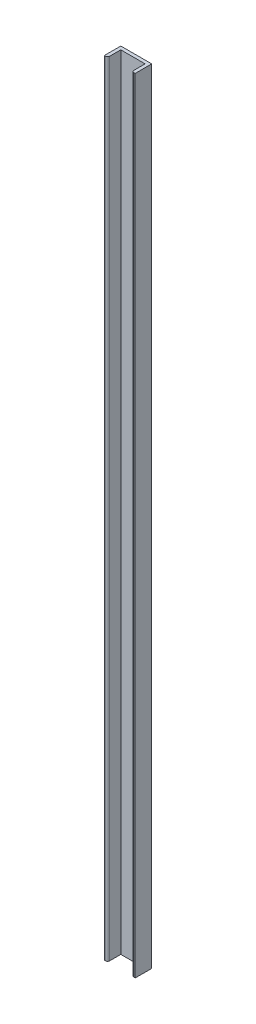
ISO-10303-21;
HEADER;
FILE_DESCRIPTION(('STEP AP214'),'2;1');
FILE_NAME('part.step','',(''),(''),'','','');
FILE_SCHEMA(('AUTOMOTIVE_DESIGN { 1 0 10303 214 1 1 1 1 }'));
ENDSEC;
DATA;
#1=APPLICATION_CONTEXT('core data for automotive mechanical design processes');
#2=APPLICATION_PROTOCOL_DEFINITION('international standard','automotive_design',2000,#1);
#3=PRODUCT_CONTEXT('',#1,'mechanical');
#4=PRODUCT('Part','Part','',(#3));
#5=PRODUCT_RELATED_PRODUCT_CATEGORY('part','',(#4));
#6=PRODUCT_DEFINITION_FORMATION('','',#4);
#7=PRODUCT_DEFINITION_CONTEXT('part definition',#1,'design');
#8=PRODUCT_DEFINITION('design','',#6,#7);
#9=PRODUCT_DEFINITION_SHAPE('','',#8);
#10=(LENGTH_UNIT() NAMED_UNIT(*) SI_UNIT(.MILLI.,.METRE.));
#11=(NAMED_UNIT(*) PLANE_ANGLE_UNIT() SI_UNIT($,.RADIAN.));
#12=(NAMED_UNIT(*) SI_UNIT($,.STERADIAN.) SOLID_ANGLE_UNIT());
#13=UNCERTAINTY_MEASURE_WITH_UNIT(LENGTH_MEASURE(1.E-05),#10,'distance_accuracy_value','');
#14=(GEOMETRIC_REPRESENTATION_CONTEXT(3) GLOBAL_UNCERTAINTY_ASSIGNED_CONTEXT((#13)) GLOBAL_UNIT_ASSIGNED_CONTEXT((#10,
#11,#12)) REPRESENTATION_CONTEXT('',''));
#15=CARTESIAN_POINT('',(0.,0.,0.));
#16=DIRECTION('',(0.,0.,1.));
#17=DIRECTION('',(1.,0.,0.));
#18=AXIS2_PLACEMENT_3D('',#15,#16,#17);
#19=CARTESIAN_POINT('',(-37.5,1900.,40.));
#20=DIRECTION('',(1.,0.,0.));
#21=DIRECTION('',(0.,0.,-1.));
#22=AXIS2_PLACEMENT_3D('',#19,#20,#21);
#23=PLANE('',#22);
#24=DIRECTION('',(0.,0.,1.));
#25=VECTOR('',#24,1.);
#26=CARTESIAN_POINT('',(-37.5,0.,40.));
#27=LINE('',#26,#25);
#28=CARTESIAN_POINT('',(-37.5,0.,0.));
#29=VERTEX_POINT('',#28);
#30=CARTESIAN_POINT('',(-37.5,0.,40.));
#31=VERTEX_POINT('',#30);
#32=EDGE_CURVE('E182',#29,#31,#27,.T.);
#33=ORIENTED_EDGE('',*,*,#32,.T.);
#34=DIRECTION('',(0.,-1.,0.));
#35=VECTOR('',#34,1.);
#36=CARTESIAN_POINT('',(-37.5,1900.,40.));
#37=LINE('',#36,#35);
#38=CARTESIAN_POINT('',(-37.5,1900.,40.));
#39=VERTEX_POINT('',#38);
#40=EDGE_CURVE('E13',#39,#31,#37,.T.);
#41=ORIENTED_EDGE('',*,*,#40,.F.);
#42=DIRECTION('',(0.,0.,1.));
#43=VECTOR('',#42,1.);
#44=CARTESIAN_POINT('',(-37.5,1900.,40.));
#45=LINE('',#44,#43);
#46=CARTESIAN_POINT('',(-37.5,1900.,0.));
#47=VERTEX_POINT('',#46);
#48=EDGE_CURVE('E200',#47,#39,#45,.T.);
#49=ORIENTED_EDGE('',*,*,#48,.F.);
#50=DIRECTION('',(0.,-1.,0.));
#51=VECTOR('',#50,1.);
#52=CARTESIAN_POINT('',(-37.5,1900.,0.));
#53=LINE('',#52,#51);
#54=EDGE_CURVE('E178',#47,#29,#53,.T.);
#55=ORIENTED_EDGE('',*,*,#54,.T.);
#56=EDGE_LOOP('',(#33,#41,#49,#55));
#57=FACE_BOUND('',#56,.T.);
#58=ADVANCED_FACE('F74',(#57),#23,.F.);
#59=CARTESIAN_POINT('',(-34.5,1900.,40.));
#60=DIRECTION('',(0.,0.,-1.));
#61=DIRECTION('',(-1.,0.,0.));
#62=AXIS2_PLACEMENT_3D('',#59,#60,#61);
#63=PLANE('',#62);
#64=DIRECTION('',(1.,0.,0.));
#65=VECTOR('',#64,1.);
#66=CARTESIAN_POINT('',(-34.5,0.,40.));
#67=LINE('',#66,#65);
#68=CARTESIAN_POINT('',(-34.5,0.,40.));
#69=VERTEX_POINT('',#68);
#70=EDGE_CURVE('E185',#31,#69,#67,.T.);
#71=ORIENTED_EDGE('',*,*,#70,.T.);
#72=DIRECTION('',(0.,-1.,0.));
#73=VECTOR('',#72,1.);
#74=CARTESIAN_POINT('',(-34.5,1900.,40.));
#75=LINE('',#74,#73);
#76=CARTESIAN_POINT('',(-34.5,1900.,40.));
#77=VERTEX_POINT('',#76);
#78=EDGE_CURVE('E82',#77,#69,#75,.T.);
#79=ORIENTED_EDGE('',*,*,#78,.F.);
#80=DIRECTION('',(1.,0.,0.));
#81=VECTOR('',#80,1.);
#82=CARTESIAN_POINT('',(-34.5,1900.,40.));
#83=LINE('',#82,#81);
#84=EDGE_CURVE('E139',#39,#77,#83,.T.);
#85=ORIENTED_EDGE('',*,*,#84,.F.);
#86=ORIENTED_EDGE('',*,*,#40,.T.);
#87=EDGE_LOOP('',(#71,#79,#85,#86));
#88=FACE_BOUND('',#87,.T.);
#89=ADVANCED_FACE('F249',(#88),#63,.F.);
#90=CARTESIAN_POINT('',(-34.5,1900.,35.));
#91=DIRECTION('',(0.,-1.,0.));
#92=DIRECTION('',(0.,0.,-1.));
#93=AXIS2_PLACEMENT_3D('',#90,#91,#92);
#94=CYLINDRICAL_SURFACE('',#93,5.);
#95=CARTESIAN_POINT('',(-34.5,0.,35.));
#96=DIRECTION('',(0.,1.,0.));
#97=DIRECTION('',(0.,0.,-1.));
#98=AXIS2_PLACEMENT_3D('',#95,#96,#97);
#99=CIRCLE('',#98,5.);
#100=CARTESIAN_POINT('',(-29.5,0.,35.));
#101=VERTEX_POINT('',#100);
#102=EDGE_CURVE('E187',#69,#101,#99,.T.);
#103=ORIENTED_EDGE('',*,*,#102,.T.);
#104=DIRECTION('',(0.,-1.,0.));
#105=VECTOR('',#104,1.);
#106=CARTESIAN_POINT('',(-29.5,1900.,35.));
#107=LINE('',#106,#105);
#108=CARTESIAN_POINT('',(-29.5,1900.,35.));
#109=VERTEX_POINT('',#108);
#110=EDGE_CURVE('E213',#109,#101,#107,.T.);
#111=ORIENTED_EDGE('',*,*,#110,.F.);
#112=CARTESIAN_POINT('',(-34.5,1900.,35.));
#113=DIRECTION('',(0.,1.,0.));
#114=DIRECTION('',(0.,0.,-1.));
#115=AXIS2_PLACEMENT_3D('',#112,#113,#114);
#116=CIRCLE('',#115,5.);
#117=EDGE_CURVE('E221',#77,#109,#116,.T.);
#118=ORIENTED_EDGE('',*,*,#117,.F.);
#119=ORIENTED_EDGE('',*,*,#78,.T.);
#120=EDGE_LOOP('',(#103,#111,#118,#119));
#121=FACE_BOUND('',#120,.T.);
#122=ADVANCED_FACE('F219',(#121),#94,.T.);
#123=CARTESIAN_POINT('',(-29.5,1900.,8.00000000000001));
#124=DIRECTION('',(-1.,0.,0.));
#125=DIRECTION('',(0.,0.,1.));
#126=AXIS2_PLACEMENT_3D('',#123,#124,#125);
#127=PLANE('',#126);
#128=DIRECTION('',(0.,0.,-1.));
#129=VECTOR('',#128,1.);
#130=CARTESIAN_POINT('',(-29.5,0.,8.00000000000001));
#131=LINE('',#130,#129);
#132=CARTESIAN_POINT('',(-29.5,0.,8.00000000000001));
#133=VERTEX_POINT('',#132);
#134=EDGE_CURVE('E189',#101,#133,#131,.T.);
#135=ORIENTED_EDGE('',*,*,#134,.T.);
#136=DIRECTION('',(0.,-1.,0.));
#137=VECTOR('',#136,1.);
#138=CARTESIAN_POINT('',(-29.5,1900.,8.00000000000001));
#139=LINE('',#138,#137);
#140=CARTESIAN_POINT('',(-29.5,1900.,8.00000000000001));
#141=VERTEX_POINT('',#140);
#142=EDGE_CURVE('E210',#141,#133,#139,.T.);
#143=ORIENTED_EDGE('',*,*,#142,.F.);
#144=DIRECTION('',(0.,0.,-1.));
#145=VECTOR('',#144,1.);
#146=CARTESIAN_POINT('',(-29.5,1900.,8.00000000000001));
#147=LINE('',#146,#145);
#148=EDGE_CURVE('E239',#109,#141,#147,.T.);
#149=ORIENTED_EDGE('',*,*,#148,.F.);
#150=ORIENTED_EDGE('',*,*,#110,.T.);
#151=EDGE_LOOP('',(#135,#143,#149,#150));
#152=FACE_BOUND('',#151,.T.);
#153=ADVANCED_FACE('F230',(#152),#127,.F.);
#154=CARTESIAN_POINT('',(29.5,1900.,8.));
#155=DIRECTION('',(0.,0.,-1.));
#156=DIRECTION('',(-1.,0.,0.));
#157=AXIS2_PLACEMENT_3D('',#154,#155,#156);
#158=PLANE('',#157);
#159=DIRECTION('',(1.,0.,0.));
#160=VECTOR('',#159,1.);
#161=CARTESIAN_POINT('',(29.5,0.,8.));
#162=LINE('',#161,#160);
#163=CARTESIAN_POINT('',(29.5,0.,8.));
#164=VERTEX_POINT('',#163);
#165=EDGE_CURVE('E191',#133,#164,#162,.T.);
#166=ORIENTED_EDGE('',*,*,#165,.T.);
#167=DIRECTION('',(0.,-1.,0.));
#168=VECTOR('',#167,1.);
#169=CARTESIAN_POINT('',(29.5,1900.,8.));
#170=LINE('',#169,#168);
#171=CARTESIAN_POINT('',(29.5,1900.,8.));
#172=VERTEX_POINT('',#171);
#173=EDGE_CURVE('E207',#172,#164,#170,.T.);
#174=ORIENTED_EDGE('',*,*,#173,.F.);
#175=DIRECTION('',(1.,0.,0.));
#176=VECTOR('',#175,1.);
#177=CARTESIAN_POINT('',(29.5,1900.,8.));
#178=LINE('',#177,#176);
#179=EDGE_CURVE('E236',#141,#172,#178,.T.);
#180=ORIENTED_EDGE('',*,*,#179,.F.);
#181=ORIENTED_EDGE('',*,*,#142,.T.);
#182=EDGE_LOOP('',(#166,#174,#180,#181));
#183=FACE_BOUND('',#182,.T.);
#184=ADVANCED_FACE('F234',(#183),#158,.F.);
#185=CARTESIAN_POINT('',(29.5,1900.,35.));
#186=DIRECTION('',(1.,0.,0.));
#187=DIRECTION('',(0.,0.,-1.));
#188=AXIS2_PLACEMENT_3D('',#185,#186,#187);
#189=PLANE('',#188);
#190=DIRECTION('',(0.,0.,1.));
#191=VECTOR('',#190,1.);
#192=CARTESIAN_POINT('',(29.5,0.,35.));
#193=LINE('',#192,#191);
#194=CARTESIAN_POINT('',(29.5,0.,35.));
#195=VERTEX_POINT('',#194);
#196=EDGE_CURVE('E193',#164,#195,#193,.T.);
#197=ORIENTED_EDGE('',*,*,#196,.T.);
#198=DIRECTION('',(0.,-1.,0.));
#199=VECTOR('',#198,1.);
#200=CARTESIAN_POINT('',(29.5,1900.,35.));
#201=LINE('',#200,#199);
#202=CARTESIAN_POINT('',(29.5,1900.,35.));
#203=VERTEX_POINT('',#202);
#204=EDGE_CURVE('E204',#203,#195,#201,.T.);
#205=ORIENTED_EDGE('',*,*,#204,.F.);
#206=DIRECTION('',(0.,0.,1.));
#207=VECTOR('',#206,1.);
#208=CARTESIAN_POINT('',(29.5,1900.,35.));
#209=LINE('',#208,#207);
#210=EDGE_CURVE('E238',#172,#203,#209,.T.);
#211=ORIENTED_EDGE('',*,*,#210,.F.);
#212=ORIENTED_EDGE('',*,*,#173,.T.);
#213=EDGE_LOOP('',(#197,#205,#211,#212));
#214=FACE_BOUND('',#213,.T.);
#215=ADVANCED_FACE('F261',(#214),#189,.F.);
#216=CARTESIAN_POINT('',(34.5,1900.,35.));
#217=DIRECTION('',(0.,-1.,0.));
#218=DIRECTION('',(0.,0.,-1.));
#219=AXIS2_PLACEMENT_3D('',#216,#217,#218);
#220=CYLINDRICAL_SURFACE('',#219,5.);
#221=CARTESIAN_POINT('',(34.5,0.,35.));
#222=DIRECTION('',(0.,1.,0.));
#223=DIRECTION('',(0.,0.,-1.));
#224=AXIS2_PLACEMENT_3D('',#221,#222,#223);
#225=CIRCLE('',#224,5.);
#226=CARTESIAN_POINT('',(34.5,0.,40.));
#227=VERTEX_POINT('',#226);
#228=EDGE_CURVE('E195',#195,#227,#225,.T.);
#229=ORIENTED_EDGE('',*,*,#228,.T.);
#230=DIRECTION('',(0.,-1.,0.));
#231=VECTOR('',#230,1.);
#232=CARTESIAN_POINT('',(34.5,1900.,40.));
#233=LINE('',#232,#231);
#234=CARTESIAN_POINT('',(34.5,1900.,40.));
#235=VERTEX_POINT('',#234);
#236=EDGE_CURVE('E173',#235,#227,#233,.T.);
#237=ORIENTED_EDGE('',*,*,#236,.F.);
#238=CARTESIAN_POINT('',(34.5,1900.,35.));
#239=DIRECTION('',(0.,1.,0.));
#240=DIRECTION('',(0.,0.,-1.));
#241=AXIS2_PLACEMENT_3D('',#238,#239,#240);
#242=CIRCLE('',#241,5.);
#243=EDGE_CURVE('E164',#203,#235,#242,.T.);
#244=ORIENTED_EDGE('',*,*,#243,.F.);
#245=ORIENTED_EDGE('',*,*,#204,.T.);
#246=EDGE_LOOP('',(#229,#237,#244,#245));
#247=FACE_BOUND('',#246,.T.);
#248=ADVANCED_FACE('F264',(#247),#220,.T.);
#249=CARTESIAN_POINT('',(37.5,1900.,40.));
#250=DIRECTION('',(0.,0.,-1.));
#251=DIRECTION('',(-1.,0.,0.));
#252=AXIS2_PLACEMENT_3D('',#249,#250,#251);
#253=PLANE('',#252);
#254=DIRECTION('',(1.,0.,0.));
#255=VECTOR('',#254,1.);
#256=CARTESIAN_POINT('',(37.5,0.,40.));
#257=LINE('',#256,#255);
#258=CARTESIAN_POINT('',(37.5,0.,40.));
#259=VERTEX_POINT('',#258);
#260=EDGE_CURVE('E172',#227,#259,#257,.T.);
#261=ORIENTED_EDGE('',*,*,#260,.T.);
#262=DIRECTION('',(0.,-1.,0.));
#263=VECTOR('',#262,1.);
#264=CARTESIAN_POINT('',(37.5,1900.,40.));
#265=LINE('',#264,#263);
#266=CARTESIAN_POINT('',(37.5,1900.,40.));
#267=VERTEX_POINT('',#266);
#268=EDGE_CURVE('E169',#267,#259,#265,.T.);
#269=ORIENTED_EDGE('',*,*,#268,.F.);
#270=DIRECTION('',(1.,0.,0.));
#271=VECTOR('',#270,1.);
#272=CARTESIAN_POINT('',(37.5,1900.,40.));
#273=LINE('',#272,#271);
#274=EDGE_CURVE('E158',#235,#267,#273,.T.);
#275=ORIENTED_EDGE('',*,*,#274,.F.);
#276=ORIENTED_EDGE('',*,*,#236,.T.);
#277=EDGE_LOOP('',(#261,#269,#275,#276));
#278=FACE_BOUND('',#277,.T.);
#279=ADVANCED_FACE('F170',(#278),#253,.F.);
#280=CARTESIAN_POINT('',(37.5,1900.,0.));
#281=DIRECTION('',(-1.,0.,0.));
#282=DIRECTION('',(0.,0.,1.));
#283=AXIS2_PLACEMENT_3D('',#280,#281,#282);
#284=PLANE('',#283);
#285=DIRECTION('',(0.,0.,-1.));
#286=VECTOR('',#285,1.);
#287=CARTESIAN_POINT('',(37.5,0.,0.));
#288=LINE('',#287,#286);
#289=CARTESIAN_POINT('',(37.5,0.,0.));
#290=VERTEX_POINT('',#289);
#291=EDGE_CURVE('E125',#259,#290,#288,.T.);
#292=ORIENTED_EDGE('',*,*,#291,.T.);
#293=DIRECTION('',(0.,-1.,0.));
#294=VECTOR('',#293,1.);
#295=CARTESIAN_POINT('',(37.5,1900.,0.));
#296=LINE('',#295,#294);
#297=CARTESIAN_POINT('',(37.5,1900.,0.));
#298=VERTEX_POINT('',#297);
#299=EDGE_CURVE('E174',#298,#290,#296,.T.);
#300=ORIENTED_EDGE('',*,*,#299,.F.);
#301=DIRECTION('',(0.,0.,-1.));
#302=VECTOR('',#301,1.);
#303=CARTESIAN_POINT('',(37.5,1900.,0.));
#304=LINE('',#303,#302);
#305=EDGE_CURVE('E162',#267,#298,#304,.T.);
#306=ORIENTED_EDGE('',*,*,#305,.F.);
#307=ORIENTED_EDGE('',*,*,#268,.T.);
#308=EDGE_LOOP('',(#292,#300,#306,#307));
#309=FACE_BOUND('',#308,.T.);
#310=ADVANCED_FACE('F176',(#309),#284,.F.);
#311=CARTESIAN_POINT('',(-37.5,1900.,0.));
#312=DIRECTION('',(0.,0.,1.));
#313=DIRECTION('',(1.,0.,0.));
#314=AXIS2_PLACEMENT_3D('',#311,#312,#313);
#315=PLANE('',#314);
#316=DIRECTION('',(-1.,0.,0.));
#317=VECTOR('',#316,1.);
#318=CARTESIAN_POINT('',(-37.5,0.,0.));
#319=LINE('',#318,#317);
#320=EDGE_CURVE('E131',#290,#29,#319,.T.);
#321=ORIENTED_EDGE('',*,*,#320,.T.);
#322=ORIENTED_EDGE('',*,*,#54,.F.);
#323=DIRECTION('',(-1.,0.,0.));
#324=VECTOR('',#323,1.);
#325=CARTESIAN_POINT('',(-37.5,1900.,0.));
#326=LINE('',#325,#324);
#327=EDGE_CURVE('E90',#298,#47,#326,.T.);
#328=ORIENTED_EDGE('',*,*,#327,.F.);
#329=ORIENTED_EDGE('',*,*,#299,.T.);
#330=EDGE_LOOP('',(#321,#322,#328,#329));
#331=FACE_BOUND('',#330,.T.);
#332=ADVANCED_FACE('F273',(#331),#315,.F.);
#333=CARTESIAN_POINT('',(34.5,1900.,35.));
#334=DIRECTION('',(0.,-1.,0.));
#335=DIRECTION('',(0.,0.,-1.));
#336=AXIS2_PLACEMENT_3D('',#333,#334,#335);
#337=PLANE('',#336);
#338=ORIENTED_EDGE('',*,*,#48,.T.);
#339=ORIENTED_EDGE('',*,*,#84,.T.);
#340=ORIENTED_EDGE('',*,*,#117,.T.);
#341=ORIENTED_EDGE('',*,*,#148,.T.);
#342=ORIENTED_EDGE('',*,*,#179,.T.);
#343=ORIENTED_EDGE('',*,*,#210,.T.);
#344=ORIENTED_EDGE('',*,*,#243,.T.);
#345=ORIENTED_EDGE('',*,*,#274,.T.);
#346=ORIENTED_EDGE('',*,*,#305,.T.);
#347=ORIENTED_EDGE('',*,*,#327,.T.);
#348=EDGE_LOOP('',(#338,#339,#340,#341,#342,#343,#344,#345,#346,#347));
#349=FACE_BOUND('',#348,.T.);
#350=ADVANCED_FACE('F160',(#349),#337,.F.);
#351=CARTESIAN_POINT('',(34.5,0.,35.));
#352=DIRECTION('',(0.,-1.,0.));
#353=DIRECTION('',(0.,0.,-1.));
#354=AXIS2_PLACEMENT_3D('',#351,#352,#353);
#355=PLANE('',#354);
#356=ORIENTED_EDGE('',*,*,#32,.F.);
#357=ORIENTED_EDGE('',*,*,#320,.F.);
#358=ORIENTED_EDGE('',*,*,#291,.F.);
#359=ORIENTED_EDGE('',*,*,#260,.F.);
#360=ORIENTED_EDGE('',*,*,#228,.F.);
#361=ORIENTED_EDGE('',*,*,#196,.F.);
#362=ORIENTED_EDGE('',*,*,#165,.F.);
#363=ORIENTED_EDGE('',*,*,#134,.F.);
#364=ORIENTED_EDGE('',*,*,#102,.F.);
#365=ORIENTED_EDGE('',*,*,#70,.F.);
#366=EDGE_LOOP('',(#356,#357,#358,#359,#360,#361,#362,#363,#364,#365));
#367=FACE_BOUND('',#366,.T.);
#368=ADVANCED_FACE('F225',(#367),#355,.T.);
#369=CLOSED_SHELL('',(#58,#89,#122,#153,#184,#215,#248,#279,#310,#332,#350,#368));
#370=MANIFOLD_SOLID_BREP('B2',#369);
#371=ADVANCED_BREP_SHAPE_REPRESENTATION('',(#18,#370),#14);
#372=SHAPE_DEFINITION_REPRESENTATION(#9,#371);
ENDSEC;
END-ISO-10303-21;
